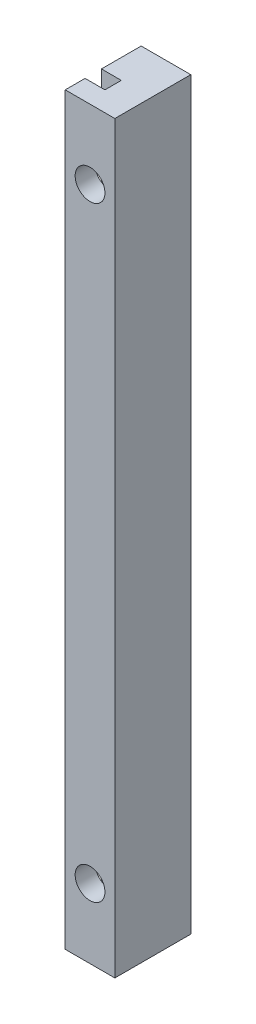
ISO-10303-21;
HEADER;
FILE_DESCRIPTION(('STEP AP214'),'2;1');
FILE_NAME('part.step','',(''),(''),'','','');
FILE_SCHEMA(('AUTOMOTIVE_DESIGN { 1 0 10303 214 1 1 1 1 }'));
ENDSEC;
DATA;
#1=APPLICATION_CONTEXT('core data for automotive mechanical design processes');
#2=APPLICATION_PROTOCOL_DEFINITION('international standard','automotive_design',2000,#1);
#3=PRODUCT_CONTEXT('',#1,'mechanical');
#4=PRODUCT('Part','Part','',(#3));
#5=PRODUCT_RELATED_PRODUCT_CATEGORY('part','',(#4));
#6=PRODUCT_DEFINITION_FORMATION('','',#4);
#7=PRODUCT_DEFINITION_CONTEXT('part definition',#1,'design');
#8=PRODUCT_DEFINITION('design','',#6,#7);
#9=PRODUCT_DEFINITION_SHAPE('','',#8);
#10=(LENGTH_UNIT() NAMED_UNIT(*) SI_UNIT(.MILLI.,.METRE.));
#11=(NAMED_UNIT(*) PLANE_ANGLE_UNIT() SI_UNIT($,.RADIAN.));
#12=(NAMED_UNIT(*) SI_UNIT($,.STERADIAN.) SOLID_ANGLE_UNIT());
#13=UNCERTAINTY_MEASURE_WITH_UNIT(LENGTH_MEASURE(1.E-05),#10,'distance_accuracy_value','');
#14=(GEOMETRIC_REPRESENTATION_CONTEXT(3) GLOBAL_UNCERTAINTY_ASSIGNED_CONTEXT((#13)) GLOBAL_UNIT_ASSIGNED_CONTEXT((#10,
#11,#12)) REPRESENTATION_CONTEXT('',''));
#15=CARTESIAN_POINT('',(0.,0.,0.));
#16=DIRECTION('',(0.,0.,1.));
#17=DIRECTION('',(1.,0.,0.));
#18=AXIS2_PLACEMENT_3D('',#15,#16,#17);
#19=CARTESIAN_POINT('',(-28.9999999999998,-5.00000000000267,5.65));
#20=DIRECTION('',(1.,0.,0.));
#21=DIRECTION('',(0.,1.,0.));
#22=AXIS2_PLACEMENT_3D('',#19,#20,#21);
#23=PLANE('',#22);
#24=DIRECTION('',(0.,-1.,0.));
#25=VECTOR('',#24,1.);
#26=CARTESIAN_POINT('',(-28.9999999999998,-5.00000000000267,4.));
#27=LINE('',#26,#25);
#28=CARTESIAN_POINT('',(-28.9999999999998,-13.4142135623758,4.));
#29=VERTEX_POINT('',#28);
#30=CARTESIAN_POINT('',(-28.9999999999998,-71.58578643763,4.));
#31=VERTEX_POINT('',#30);
#32=EDGE_CURVE('E160',#29,#31,#27,.T.);
#33=ORIENTED_EDGE('',*,*,#32,.T.);
#34=DIRECTION('',(0.,0.,1.));
#35=VECTOR('',#34,1.);
#36=CARTESIAN_POINT('',(-28.9999999999998,-71.58578643763,0.));
#37=LINE('',#36,#35);
#38=CARTESIAN_POINT('',(-28.9999999999998,-71.58578643763,5.65));
#39=VERTEX_POINT('',#38);
#40=EDGE_CURVE('E194',#31,#39,#37,.T.);
#41=ORIENTED_EDGE('',*,*,#40,.T.);
#42=DIRECTION('',(0.,-1.,0.));
#43=VECTOR('',#42,1.);
#44=CARTESIAN_POINT('',(-28.9999999999998,-5.00000000000267,5.65));
#45=LINE('',#44,#43);
#46=CARTESIAN_POINT('',(-28.9999999999998,-13.4142135623758,5.65));
#47=VERTEX_POINT('',#46);
#48=EDGE_CURVE('E149',#47,#39,#45,.T.);
#49=ORIENTED_EDGE('',*,*,#48,.F.);
#50=DIRECTION('',(0.,0.,1.));
#51=VECTOR('',#50,1.);
#52=CARTESIAN_POINT('',(-28.9999999999998,-13.4142135623758,0.));
#53=LINE('',#52,#51);
#54=EDGE_CURVE('E63',#47,#29,#53,.F.);
#55=ORIENTED_EDGE('',*,*,#54,.T.);
#56=EDGE_LOOP('',(#33,#41,#49,#55));
#57=FACE_BOUND('',#56,.T.);
#58=ADVANCED_FACE('F41',(#57),#23,.F.);
#59=CARTESIAN_POINT('',(-28.9999999999998,-5.00000000000267,4.));
#60=VERTEX_POINT('',#59);
#61=CARTESIAN_POINT('',(-28.9999999999998,-10.5857864376296,4.));
#62=VERTEX_POINT('',#61);
#63=EDGE_CURVE('E142',#60,#62,#27,.T.);
#64=ORIENTED_EDGE('',*,*,#63,.T.);
#65=DIRECTION('',(0.,0.,1.));
#66=VECTOR('',#65,1.);
#67=CARTESIAN_POINT('',(-28.9999999999998,-10.5857864376296,0.));
#68=LINE('',#67,#66);
#69=CARTESIAN_POINT('',(-28.9999999999998,-10.5857864376296,5.65));
#70=VERTEX_POINT('',#69);
#71=EDGE_CURVE('E128',#62,#70,#68,.T.);
#72=ORIENTED_EDGE('',*,*,#71,.T.);
#73=CARTESIAN_POINT('',(-28.9999999999998,-5.00000000000267,5.65));
#74=VERTEX_POINT('',#73);
#75=EDGE_CURVE('E140',#74,#70,#45,.T.);
#76=ORIENTED_EDGE('',*,*,#75,.F.);
#77=DIRECTION('',(0.,0.,-1.));
#78=VECTOR('',#77,1.);
#79=CARTESIAN_POINT('',(-28.9999999999998,-5.00000000000267,5.65));
#80=LINE('',#79,#78);
#81=EDGE_CURVE('E153',#74,#60,#80,.T.);
#82=ORIENTED_EDGE('',*,*,#81,.T.);
#83=EDGE_LOOP('',(#64,#72,#76,#82));
#84=FACE_BOUND('',#83,.T.);
#85=ADVANCED_FACE('F138',(#84),#23,.F.);
#86=CARTESIAN_POINT('',(0.,0.,4.));
#87=DIRECTION('',(0.,0.,-1.));
#88=DIRECTION('',(-1.,0.,0.));
#89=AXIS2_PLACEMENT_3D('',#86,#87,#88);
#90=PLANE('',#89);
#91=CARTESIAN_POINT('',(-28.9999999999998,-74.4142135623762,4.));
#92=VERTEX_POINT('',#91);
#93=CARTESIAN_POINT('',(-28.9999999999998,-80.0000000000027,4.));
#94=VERTEX_POINT('',#93);
#95=EDGE_CURVE('E161',#92,#94,#27,.T.);
#96=ORIENTED_EDGE('',*,*,#95,.F.);
#97=CARTESIAN_POINT('',(-28.4999999999998,-73.0000000000031,4.));
#98=DIRECTION('',(0.,0.,-1.));
#99=DIRECTION('',(-1.,0.,0.));
#100=AXIS2_PLACEMENT_3D('',#97,#98,#99);
#101=CIRCLE('',#100,1.5);
#102=EDGE_CURVE('E183',#92,#31,#101,.T.);
#103=ORIENTED_EDGE('',*,*,#102,.T.);
#104=ORIENTED_EDGE('',*,*,#32,.F.);
#105=CARTESIAN_POINT('',(-28.4999999999998,-12.0000000000027,4.));
#106=DIRECTION('',(0.,0.,-1.));
#107=DIRECTION('',(-1.,0.,0.));
#108=AXIS2_PLACEMENT_3D('',#105,#106,#107);
#109=CIRCLE('',#108,1.5);
#110=EDGE_CURVE('E143',#29,#62,#109,.T.);
#111=ORIENTED_EDGE('',*,*,#110,.T.);
#112=ORIENTED_EDGE('',*,*,#63,.F.);
#113=DIRECTION('',(-1.,0.,0.));
#114=VECTOR('',#113,1.);
#115=CARTESIAN_POINT('',(-25.9999999999998,-5.00000000000267,4.));
#116=LINE('',#115,#114);
#117=CARTESIAN_POINT('',(-30.9999999999998,-5.00000000000267,4.));
#118=VERTEX_POINT('',#117);
#119=EDGE_CURVE('E270',#60,#118,#116,.T.);
#120=ORIENTED_EDGE('',*,*,#119,.T.);
#121=DIRECTION('',(0.,-1.,0.));
#122=VECTOR('',#121,1.);
#123=CARTESIAN_POINT('',(-30.9999999999998,-5.00000000000267,4.));
#124=LINE('',#123,#122);
#125=CARTESIAN_POINT('',(-30.9999999999998,-80.0000000000027,4.));
#126=VERTEX_POINT('',#125);
#127=EDGE_CURVE('E253',#118,#126,#124,.T.);
#128=ORIENTED_EDGE('',*,*,#127,.T.);
#129=DIRECTION('',(1.,0.,0.));
#130=VECTOR('',#129,1.);
#131=CARTESIAN_POINT('',(-25.9999999999998,-80.0000000000027,4.));
#132=LINE('',#131,#130);
#133=EDGE_CURVE('E250',#126,#94,#132,.T.);
#134=ORIENTED_EDGE('',*,*,#133,.T.);
#135=EDGE_LOOP('',(#96,#103,#104,#111,#112,#120,#128,#134));
#136=FACE_BOUND('',#135,.T.);
#137=ADVANCED_FACE('F277',(#136),#90,.F.);
#138=CARTESIAN_POINT('',(-25.9999999999998,-5.00000000000267,4.));
#139=DIRECTION('',(-1.,0.,0.));
#140=DIRECTION('',(0.,0.,1.));
#141=AXIS2_PLACEMENT_3D('',#138,#139,#140);
#142=PLANE('',#141);
#143=DIRECTION('',(0.,1.,0.));
#144=VECTOR('',#143,1.);
#145=CARTESIAN_POINT('',(-25.9999999999998,-5.00000000000267,0.));
#146=LINE('',#145,#144);
#147=CARTESIAN_POINT('',(-25.9999999999998,-80.0000000000027,0.));
#148=VERTEX_POINT('',#147);
#149=CARTESIAN_POINT('',(-25.9999999999998,-5.00000000000267,0.));
#150=VERTEX_POINT('',#149);
#151=EDGE_CURVE('E238',#148,#150,#146,.T.);
#152=ORIENTED_EDGE('',*,*,#151,.T.);
#153=DIRECTION('',(0.,0.,-1.));
#154=VECTOR('',#153,1.);
#155=CARTESIAN_POINT('',(-25.9999999999998,-5.00000000000267,4.));
#156=LINE('',#155,#154);
#157=CARTESIAN_POINT('',(-25.9999999999998,-5.00000000000267,7.65));
#158=VERTEX_POINT('',#157);
#159=EDGE_CURVE('E134',#158,#150,#156,.T.);
#160=ORIENTED_EDGE('',*,*,#159,.F.);
#161=DIRECTION('',(0.,1.,0.));
#162=VECTOR('',#161,1.);
#163=CARTESIAN_POINT('',(-25.9999999999998,-5.00000000000267,7.65));
#164=LINE('',#163,#162);
#165=CARTESIAN_POINT('',(-25.9999999999998,-80.0000000000031,7.65));
#166=VERTEX_POINT('',#165);
#167=EDGE_CURVE('E179',#166,#158,#164,.T.);
#168=ORIENTED_EDGE('',*,*,#167,.F.);
#169=DIRECTION('',(0.,0.,-1.));
#170=VECTOR('',#169,1.);
#171=CARTESIAN_POINT('',(-25.9999999999998,-80.0000000000027,4.));
#172=LINE('',#171,#170);
#173=EDGE_CURVE('E235',#166,#148,#172,.T.);
#174=ORIENTED_EDGE('',*,*,#173,.T.);
#175=EDGE_LOOP('',(#152,#160,#168,#174));
#176=FACE_BOUND('',#175,.T.);
#177=ADVANCED_FACE('F43',(#176),#142,.F.);
#178=CARTESIAN_POINT('',(-25.9999999999998,-5.00000000000267,4.));
#179=DIRECTION('',(0.,-1.,0.));
#180=DIRECTION('',(1.,0.,0.));
#181=AXIS2_PLACEMENT_3D('',#178,#179,#180);
#182=PLANE('',#181);
#183=DIRECTION('',(-1.,0.,0.));
#184=VECTOR('',#183,1.);
#185=CARTESIAN_POINT('',(-25.9999999999998,-5.00000000000267,0.));
#186=LINE('',#185,#184);
#187=CARTESIAN_POINT('',(-30.9999999999998,-5.00000000000267,0.));
#188=VERTEX_POINT('',#187);
#189=EDGE_CURVE('E268',#150,#188,#186,.T.);
#190=ORIENTED_EDGE('',*,*,#189,.T.);
#191=DIRECTION('',(0.,0.,-1.));
#192=VECTOR('',#191,1.);
#193=CARTESIAN_POINT('',(-30.9999999999998,-5.00000000000267,4.));
#194=LINE('',#193,#192);
#195=EDGE_CURVE('E240',#118,#188,#194,.T.);
#196=ORIENTED_EDGE('',*,*,#195,.F.);
#197=ORIENTED_EDGE('',*,*,#119,.F.);
#198=ORIENTED_EDGE('',*,*,#81,.F.);
#199=DIRECTION('',(-1.,0.,0.));
#200=VECTOR('',#199,1.);
#201=CARTESIAN_POINT('',(-25.9999999999998,-5.00000000000267,5.65));
#202=LINE('',#201,#200);
#203=CARTESIAN_POINT('',(-30.9999999999998,-5.00000000000267,5.65));
#204=VERTEX_POINT('',#203);
#205=EDGE_CURVE('E147',#74,#204,#202,.T.);
#206=ORIENTED_EDGE('',*,*,#205,.T.);
#207=DIRECTION('',(0.,0.,-1.));
#208=VECTOR('',#207,1.);
#209=CARTESIAN_POINT('',(-30.9999999999998,-5.00000000000267,7.65));
#210=LINE('',#209,#208);
#211=CARTESIAN_POINT('',(-30.9999999999998,-5.00000000000267,7.65));
#212=VERTEX_POINT('',#211);
#213=EDGE_CURVE('E163',#212,#204,#210,.T.);
#214=ORIENTED_EDGE('',*,*,#213,.F.);
#215=DIRECTION('',(-1.,0.,0.));
#216=VECTOR('',#215,1.);
#217=CARTESIAN_POINT('',(-25.9999999999998,-5.00000000000267,7.65));
#218=LINE('',#217,#216);
#219=EDGE_CURVE('E188',#158,#212,#218,.T.);
#220=ORIENTED_EDGE('',*,*,#219,.F.);
#221=ORIENTED_EDGE('',*,*,#159,.T.);
#222=EDGE_LOOP('',(#190,#196,#197,#198,#206,#214,#220,#221));
#223=FACE_BOUND('',#222,.T.);
#224=ADVANCED_FACE('F242',(#223),#182,.F.);
#225=CARTESIAN_POINT('',(-30.9999999999998,-5.00000000000267,4.));
#226=DIRECTION('',(1.,0.,0.));
#227=DIRECTION('',(0.,1.,0.));
#228=AXIS2_PLACEMENT_3D('',#225,#226,#227);
#229=PLANE('',#228);
#230=DIRECTION('',(0.,-1.,0.));
#231=VECTOR('',#230,1.);
#232=CARTESIAN_POINT('',(-30.9999999999998,-5.00000000000267,0.));
#233=LINE('',#232,#231);
#234=CARTESIAN_POINT('',(-30.9999999999998,-80.0000000000027,0.));
#235=VERTEX_POINT('',#234);
#236=EDGE_CURVE('E265',#188,#235,#233,.T.);
#237=ORIENTED_EDGE('',*,*,#236,.T.);
#238=DIRECTION('',(0.,0.,-1.));
#239=VECTOR('',#238,1.);
#240=CARTESIAN_POINT('',(-30.9999999999998,-80.0000000000027,4.));
#241=LINE('',#240,#239);
#242=EDGE_CURVE('E249',#126,#235,#241,.T.);
#243=ORIENTED_EDGE('',*,*,#242,.F.);
#244=ORIENTED_EDGE('',*,*,#127,.F.);
#245=ORIENTED_EDGE('',*,*,#195,.T.);
#246=EDGE_LOOP('',(#237,#243,#244,#245));
#247=FACE_BOUND('',#246,.T.);
#248=ADVANCED_FACE('F263',(#247),#229,.F.);
#249=CARTESIAN_POINT('',(-25.9999999999998,-80.0000000000027,4.));
#250=DIRECTION('',(0.,1.,0.));
#251=DIRECTION('',(0.,0.,1.));
#252=AXIS2_PLACEMENT_3D('',#249,#250,#251);
#253=PLANE('',#252);
#254=DIRECTION('',(1.,0.,0.));
#255=VECTOR('',#254,1.);
#256=CARTESIAN_POINT('',(-25.9999999999998,-80.0000000000027,0.));
#257=LINE('',#256,#255);
#258=EDGE_CURVE('E248',#235,#148,#257,.T.);
#259=ORIENTED_EDGE('',*,*,#258,.T.);
#260=ORIENTED_EDGE('',*,*,#173,.F.);
#261=DIRECTION('',(1.,0.,0.));
#262=VECTOR('',#261,1.);
#263=CARTESIAN_POINT('',(-25.9999999999998,-80.0000000000031,7.65));
#264=LINE('',#263,#262);
#265=CARTESIAN_POINT('',(-30.9999999999998,-80.0000000000031,7.65));
#266=VERTEX_POINT('',#265);
#267=EDGE_CURVE('E173',#266,#166,#264,.T.);
#268=ORIENTED_EDGE('',*,*,#267,.F.);
#269=DIRECTION('',(0.,0.,-1.));
#270=VECTOR('',#269,1.);
#271=CARTESIAN_POINT('',(-30.9999999999998,-80.0000000000031,7.65));
#272=LINE('',#271,#270);
#273=CARTESIAN_POINT('',(-30.9999999999998,-80.0000000000031,5.65));
#274=VERTEX_POINT('',#273);
#275=EDGE_CURVE('E168',#266,#274,#272,.T.);
#276=ORIENTED_EDGE('',*,*,#275,.T.);
#277=DIRECTION('',(1.,0.,0.));
#278=VECTOR('',#277,1.);
#279=CARTESIAN_POINT('',(-25.9999999999998,-80.0000000000031,5.65));
#280=LINE('',#279,#278);
#281=CARTESIAN_POINT('',(-28.9999999999998,-80.0000000000031,5.65));
#282=VERTEX_POINT('',#281);
#283=EDGE_CURVE('E176',#274,#282,#280,.T.);
#284=ORIENTED_EDGE('',*,*,#283,.T.);
#285=DIRECTION('',(0.,0.,-1.));
#286=VECTOR('',#285,1.);
#287=CARTESIAN_POINT('',(-28.9999999999998,-80.0000000000027,5.65));
#288=LINE('',#287,#286);
#289=EDGE_CURVE('E148',#282,#94,#288,.T.);
#290=ORIENTED_EDGE('',*,*,#289,.T.);
#291=ORIENTED_EDGE('',*,*,#133,.F.);
#292=ORIENTED_EDGE('',*,*,#242,.T.);
#293=EDGE_LOOP('',(#259,#260,#268,#276,#284,#290,#291,#292));
#294=FACE_BOUND('',#293,.T.);
#295=ADVANCED_FACE('F245',(#294),#253,.F.);
#296=CARTESIAN_POINT('',(0.,0.,0.));
#297=DIRECTION('',(0.,0.,-1.));
#298=DIRECTION('',(-1.,0.,0.));
#299=AXIS2_PLACEMENT_3D('',#296,#297,#298);
#300=PLANE('',#299);
#301=CARTESIAN_POINT('',(-28.4999999999998,-73.0000000000031,0.));
#302=DIRECTION('',(0.,0.,1.));
#303=DIRECTION('',(1.,0.,0.));
#304=AXIS2_PLACEMENT_3D('',#301,#302,#303);
#305=CIRCLE('',#304,1.5);
#306=CARTESIAN_POINT('',(-26.9999999999998,-73.0000000000031,0.));
#307=VERTEX_POINT('',#306);
#308=EDGE_CURVE('E200',#307,#307,#305,.T.);
#309=ORIENTED_EDGE('',*,*,#308,.T.);
#310=EDGE_LOOP('',(#309));
#311=FACE_BOUND('',#310,.T.);
#312=CARTESIAN_POINT('',(-28.4999999999998,-12.0000000000027,0.));
#313=DIRECTION('',(0.,0.,1.));
#314=DIRECTION('',(1.,0.,0.));
#315=AXIS2_PLACEMENT_3D('',#312,#313,#314);
#316=CIRCLE('',#315,1.5);
#317=CARTESIAN_POINT('',(-26.9999999999998,-12.0000000000027,0.));
#318=VERTEX_POINT('',#317);
#319=EDGE_CURVE('E201',#318,#318,#316,.T.);
#320=ORIENTED_EDGE('',*,*,#319,.T.);
#321=EDGE_LOOP('',(#320));
#322=FACE_BOUND('',#321,.T.);
#323=ORIENTED_EDGE('',*,*,#151,.F.);
#324=ORIENTED_EDGE('',*,*,#258,.F.);
#325=ORIENTED_EDGE('',*,*,#236,.F.);
#326=ORIENTED_EDGE('',*,*,#189,.F.);
#327=EDGE_LOOP('',(#323,#324,#325,#326));
#328=FACE_BOUND('',#327,.T.);
#329=ADVANCED_FACE('F213',(#311,#322,#328),#300,.T.);
#330=CARTESIAN_POINT('',(-28.9999999999998,-74.4142135623762,5.65));
#331=VERTEX_POINT('',#330);
#332=EDGE_CURVE('E151',#331,#282,#45,.T.);
#333=ORIENTED_EDGE('',*,*,#332,.F.);
#334=DIRECTION('',(0.,0.,1.));
#335=VECTOR('',#334,1.);
#336=CARTESIAN_POINT('',(-28.9999999999998,-74.4142135623762,0.));
#337=LINE('',#336,#335);
#338=EDGE_CURVE('E55',#331,#92,#337,.F.);
#339=ORIENTED_EDGE('',*,*,#338,.T.);
#340=ORIENTED_EDGE('',*,*,#95,.T.);
#341=ORIENTED_EDGE('',*,*,#289,.F.);
#342=EDGE_LOOP('',(#333,#339,#340,#341));
#343=FACE_BOUND('',#342,.T.);
#344=ADVANCED_FACE('F280',(#343),#23,.F.);
#345=CARTESIAN_POINT('',(-30.9999999999998,-5.00000000000267,7.65));
#346=DIRECTION('',(1.,0.,0.));
#347=DIRECTION('',(0.,1.,0.));
#348=AXIS2_PLACEMENT_3D('',#345,#346,#347);
#349=PLANE('',#348);
#350=DIRECTION('',(0.,-1.,0.));
#351=VECTOR('',#350,1.);
#352=CARTESIAN_POINT('',(-30.9999999999998,-5.00000000000267,5.65));
#353=LINE('',#352,#351);
#354=EDGE_CURVE('E180',#204,#274,#353,.T.);
#355=ORIENTED_EDGE('',*,*,#354,.T.);
#356=ORIENTED_EDGE('',*,*,#275,.F.);
#357=DIRECTION('',(0.,-1.,0.));
#358=VECTOR('',#357,1.);
#359=CARTESIAN_POINT('',(-30.9999999999998,-5.00000000000267,7.65));
#360=LINE('',#359,#358);
#361=EDGE_CURVE('E186',#212,#266,#360,.T.);
#362=ORIENTED_EDGE('',*,*,#361,.F.);
#363=ORIENTED_EDGE('',*,*,#213,.T.);
#364=EDGE_LOOP('',(#355,#356,#362,#363));
#365=FACE_BOUND('',#364,.T.);
#366=ADVANCED_FACE('F225',(#365),#349,.F.);
#367=CARTESIAN_POINT('',(0.,0.,7.65));
#368=DIRECTION('',(0.,0.,-1.));
#369=DIRECTION('',(-1.,0.,0.));
#370=AXIS2_PLACEMENT_3D('',#367,#368,#369);
#371=PLANE('',#370);
#372=CARTESIAN_POINT('',(-28.4999999999998,-73.0000000000031,7.65));
#373=DIRECTION('',(0.,0.,1.));
#374=DIRECTION('',(1.,0.,0.));
#375=AXIS2_PLACEMENT_3D('',#372,#373,#374);
#376=CIRCLE('',#375,1.5);
#377=CARTESIAN_POINT('',(-26.9999999999998,-73.0000000000031,7.65));
#378=VERTEX_POINT('',#377);
#379=EDGE_CURVE('E207',#378,#378,#376,.T.);
#380=ORIENTED_EDGE('',*,*,#379,.F.);
#381=EDGE_LOOP('',(#380));
#382=FACE_BOUND('',#381,.T.);
#383=CARTESIAN_POINT('',(-28.4999999999998,-12.0000000000027,7.65));
#384=DIRECTION('',(0.,0.,1.));
#385=DIRECTION('',(1.,0.,0.));
#386=AXIS2_PLACEMENT_3D('',#383,#384,#385);
#387=CIRCLE('',#386,1.5);
#388=CARTESIAN_POINT('',(-26.9999999999998,-12.0000000000027,7.65));
#389=VERTEX_POINT('',#388);
#390=EDGE_CURVE('E204',#389,#389,#387,.T.);
#391=ORIENTED_EDGE('',*,*,#390,.F.);
#392=EDGE_LOOP('',(#391));
#393=FACE_BOUND('',#392,.T.);
#394=ORIENTED_EDGE('',*,*,#167,.T.);
#395=ORIENTED_EDGE('',*,*,#219,.T.);
#396=ORIENTED_EDGE('',*,*,#361,.T.);
#397=ORIENTED_EDGE('',*,*,#267,.T.);
#398=EDGE_LOOP('',(#394,#395,#396,#397));
#399=FACE_BOUND('',#398,.T.);
#400=ADVANCED_FACE('F222',(#382,#393,#399),#371,.F.);
#401=CARTESIAN_POINT('',(0.,0.,5.65));
#402=DIRECTION('',(0.,0.,-1.));
#403=DIRECTION('',(-1.,0.,0.));
#404=AXIS2_PLACEMENT_3D('',#401,#402,#403);
#405=PLANE('',#404);
#406=CARTESIAN_POINT('',(-28.4999999999998,-73.0000000000031,5.65));
#407=DIRECTION('',(0.,0.,-1.));
#408=DIRECTION('',(-1.,0.,0.));
#409=AXIS2_PLACEMENT_3D('',#406,#407,#408);
#410=CIRCLE('',#409,1.5);
#411=EDGE_CURVE('E11',#331,#39,#410,.T.);
#412=ORIENTED_EDGE('',*,*,#411,.F.);
#413=ORIENTED_EDGE('',*,*,#332,.T.);
#414=ORIENTED_EDGE('',*,*,#283,.F.);
#415=ORIENTED_EDGE('',*,*,#354,.F.);
#416=ORIENTED_EDGE('',*,*,#205,.F.);
#417=ORIENTED_EDGE('',*,*,#75,.T.);
#418=CARTESIAN_POINT('',(-28.4999999999998,-12.0000000000027,5.65));
#419=DIRECTION('',(0.,0.,-1.));
#420=DIRECTION('',(-1.,0.,0.));
#421=AXIS2_PLACEMENT_3D('',#418,#419,#420);
#422=CIRCLE('',#421,1.5);
#423=EDGE_CURVE('E49',#47,#70,#422,.T.);
#424=ORIENTED_EDGE('',*,*,#423,.F.);
#425=ORIENTED_EDGE('',*,*,#48,.T.);
#426=EDGE_LOOP('',(#412,#413,#414,#415,#416,#417,#424,#425));
#427=FACE_BOUND('',#426,.T.);
#428=ADVANCED_FACE('F145',(#427),#405,.T.);
#429=CARTESIAN_POINT('',(-28.4999999999998,-12.0000000000027,0.));
#430=DIRECTION('',(0.,0.,1.));
#431=DIRECTION('',(1.,0.,0.));
#432=AXIS2_PLACEMENT_3D('',#429,#430,#431);
#433=CYLINDRICAL_SURFACE('',#432,1.5);
#434=ORIENTED_EDGE('',*,*,#319,.F.);
#435=EDGE_LOOP('',(#434));
#436=FACE_BOUND('',#435,.T.);
#437=ORIENTED_EDGE('',*,*,#390,.T.);
#438=EDGE_LOOP('',(#437));
#439=FACE_BOUND('',#438,.T.);
#440=ORIENTED_EDGE('',*,*,#54,.F.);
#441=ORIENTED_EDGE('',*,*,#423,.T.);
#442=ORIENTED_EDGE('',*,*,#71,.F.);
#443=ORIENTED_EDGE('',*,*,#110,.F.);
#444=EDGE_LOOP('',(#440,#441,#442,#443));
#445=FACE_BOUND('',#444,.T.);
#446=ADVANCED_FACE('F127',(#436,#439,#445),#433,.F.);
#447=CARTESIAN_POINT('',(-28.4999999999998,-73.0000000000031,0.));
#448=DIRECTION('',(0.,0.,1.));
#449=DIRECTION('',(1.,0.,0.));
#450=AXIS2_PLACEMENT_3D('',#447,#448,#449);
#451=CYLINDRICAL_SURFACE('',#450,1.5);
#452=ORIENTED_EDGE('',*,*,#308,.F.);
#453=EDGE_LOOP('',(#452));
#454=FACE_BOUND('',#453,.T.);
#455=ORIENTED_EDGE('',*,*,#379,.T.);
#456=EDGE_LOOP('',(#455));
#457=FACE_BOUND('',#456,.T.);
#458=ORIENTED_EDGE('',*,*,#338,.F.);
#459=ORIENTED_EDGE('',*,*,#411,.T.);
#460=ORIENTED_EDGE('',*,*,#40,.F.);
#461=ORIENTED_EDGE('',*,*,#102,.F.);
#462=EDGE_LOOP('',(#458,#459,#460,#461));
#463=FACE_BOUND('',#462,.T.);
#464=ADVANCED_FACE('F216',(#454,#457,#463),#451,.F.);
#465=CLOSED_SHELL('',(#58,#85,#137,#177,#224,#248,#295,#329,#344,#366,#400,#428,#446,#464));
#466=MANIFOLD_SOLID_BREP('B2',#465);
#467=ADVANCED_BREP_SHAPE_REPRESENTATION('',(#18,#466),#14);
#468=SHAPE_DEFINITION_REPRESENTATION(#9,#467);
ENDSEC;
END-ISO-10303-21;
